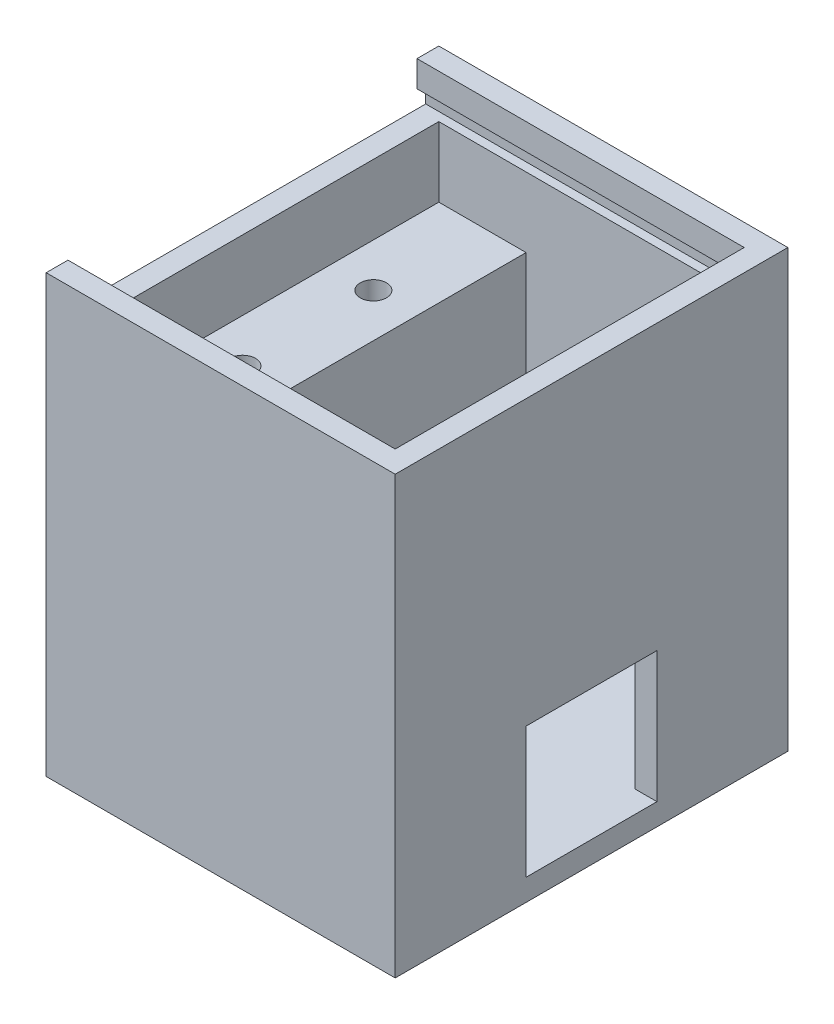
ISO-10303-21;
HEADER;
FILE_DESCRIPTION(('STEP AP214'),'2;1');
FILE_NAME('part.step','',(''),(''),'','','');
FILE_SCHEMA(('AUTOMOTIVE_DESIGN { 1 0 10303 214 1 1 1 1 }'));
ENDSEC;
DATA;
#1=APPLICATION_CONTEXT('core data for automotive mechanical design processes');
#2=APPLICATION_PROTOCOL_DEFINITION('international standard','automotive_design',2000,#1);
#3=PRODUCT_CONTEXT('',#1,'mechanical');
#4=PRODUCT('Part','Part','',(#3));
#5=PRODUCT_RELATED_PRODUCT_CATEGORY('part','',(#4));
#6=PRODUCT_DEFINITION_FORMATION('','',#4);
#7=PRODUCT_DEFINITION_CONTEXT('part definition',#1,'design');
#8=PRODUCT_DEFINITION('design','',#6,#7);
#9=PRODUCT_DEFINITION_SHAPE('','',#8);
#10=(LENGTH_UNIT() NAMED_UNIT(*) SI_UNIT(.MILLI.,.METRE.));
#11=(NAMED_UNIT(*) PLANE_ANGLE_UNIT() SI_UNIT($,.RADIAN.));
#12=(NAMED_UNIT(*) SI_UNIT($,.STERADIAN.) SOLID_ANGLE_UNIT());
#13=UNCERTAINTY_MEASURE_WITH_UNIT(LENGTH_MEASURE(1.E-05),#10,'distance_accuracy_value','');
#14=(GEOMETRIC_REPRESENTATION_CONTEXT(3) GLOBAL_UNCERTAINTY_ASSIGNED_CONTEXT((#13)) GLOBAL_UNIT_ASSIGNED_CONTEXT((#10,
#11,#12)) REPRESENTATION_CONTEXT('',''));
#15=CARTESIAN_POINT('',(0.,0.,0.));
#16=DIRECTION('',(0.,0.,1.));
#17=DIRECTION('',(1.,0.,0.));
#18=AXIS2_PLACEMENT_3D('',#15,#16,#17);
#19=CARTESIAN_POINT('',(-27.3887004628611,0.,15.9496536364091));
#20=DIRECTION('',(0.,1.,0.));
#21=DIRECTION('',(0.,0.,1.));
#22=AXIS2_PLACEMENT_3D('',#19,#20,#21);
#23=CYLINDRICAL_SURFACE('',#22,1.5);
#24=CARTESIAN_POINT('',(-27.3887004628611,37.,15.9496536364091));
#25=DIRECTION('',(0.,1.,0.));
#26=DIRECTION('',(0.,0.,1.));
#27=AXIS2_PLACEMENT_3D('',#24,#25,#26);
#28=CIRCLE('',#27,1.5);
#29=CARTESIAN_POINT('',(-27.3887004628611,37.,17.4496536364091));
#30=VERTEX_POINT('',#29);
#31=EDGE_CURVE('E234',#30,#30,#28,.T.);
#32=ORIENTED_EDGE('',*,*,#31,.T.);
#33=EDGE_LOOP('',(#32));
#34=FACE_BOUND('',#33,.T.);
#35=CARTESIAN_POINT('',(-27.3887004628611,5.,15.9496536364091));
#36=DIRECTION('',(0.,-1.,0.));
#37=DIRECTION('',(0.,0.,-1.));
#38=AXIS2_PLACEMENT_3D('',#35,#36,#37);
#39=CIRCLE('',#38,1.5);
#40=CARTESIAN_POINT('',(-27.3887004628611,5.,14.4496536364091));
#41=VERTEX_POINT('',#40);
#42=EDGE_CURVE('E37',#41,#41,#39,.F.);
#43=ORIENTED_EDGE('',*,*,#42,.F.);
#44=EDGE_LOOP('',(#43));
#45=FACE_BOUND('',#44,.T.);
#46=ADVANCED_FACE('F33',(#34,#45),#23,.F.);
#47=CARTESIAN_POINT('',(-27.3887004628611,0.,0.949653636409073));
#48=DIRECTION('',(0.,1.,0.));
#49=DIRECTION('',(0.,0.,1.));
#50=AXIS2_PLACEMENT_3D('',#47,#48,#49);
#51=CYLINDRICAL_SURFACE('',#50,1.5);
#52=CARTESIAN_POINT('',(-27.3887004628611,37.,0.949653636409079));
#53=DIRECTION('',(0.,1.,0.));
#54=DIRECTION('',(0.,0.,1.));
#55=AXIS2_PLACEMENT_3D('',#52,#53,#54);
#56=CIRCLE('',#55,1.5);
#57=CARTESIAN_POINT('',(-27.3887004628611,37.,2.44965363640908));
#58=VERTEX_POINT('',#57);
#59=EDGE_CURVE('E231',#58,#58,#56,.T.);
#60=ORIENTED_EDGE('',*,*,#59,.T.);
#61=EDGE_LOOP('',(#60));
#62=FACE_BOUND('',#61,.T.);
#63=CARTESIAN_POINT('',(-27.3887004628611,5.,0.949653636409074));
#64=DIRECTION('',(0.,-1.,0.));
#65=DIRECTION('',(0.,0.,-1.));
#66=AXIS2_PLACEMENT_3D('',#63,#64,#65);
#67=CIRCLE('',#66,1.5);
#68=CARTESIAN_POINT('',(-27.3887004628611,5.,-0.550346363590927));
#69=VERTEX_POINT('',#68);
#70=EDGE_CURVE('E222',#69,#69,#67,.F.);
#71=ORIENTED_EDGE('',*,*,#70,.F.);
#72=EDGE_LOOP('',(#71));
#73=FACE_BOUND('',#72,.T.);
#74=ADVANCED_FACE('F379',(#62,#73),#51,.F.);
#75=CARTESIAN_POINT('',(-34.8887004628611,50.,28.4496536364091));
#76=DIRECTION('',(0.,0.,-1.));
#77=DIRECTION('',(-1.,0.,0.));
#78=AXIS2_PLACEMENT_3D('',#75,#76,#77);
#79=PLANE('',#78);
#80=DIRECTION('',(-1.,0.,0.));
#81=VECTOR('',#80,1.);
#82=CARTESIAN_POINT('',(-34.8887004628611,45.,28.4496536364091));
#83=LINE('',#82,#81);
#84=CARTESIAN_POINT('',(2.61129953713887,45.,28.4496536364091));
#85=VERTEX_POINT('',#84);
#86=CARTESIAN_POINT('',(-32.3887004628611,45.,28.4496536364091));
#87=VERTEX_POINT('',#86);
#88=EDGE_CURVE('E242',#85,#87,#83,.T.);
#89=ORIENTED_EDGE('',*,*,#88,.F.);
#90=DIRECTION('',(0.,-1.,0.));
#91=VECTOR('',#90,1.);
#92=CARTESIAN_POINT('',(2.61129953713887,50.,28.4496536364091));
#93=LINE('',#92,#91);
#94=CARTESIAN_POINT('',(2.61129953713887,2.5,28.4496536364091));
#95=VERTEX_POINT('',#94);
#96=EDGE_CURVE('E329',#85,#95,#93,.T.);
#97=ORIENTED_EDGE('',*,*,#96,.T.);
#98=DIRECTION('',(1.,0.,0.));
#99=VECTOR('',#98,1.);
#100=CARTESIAN_POINT('',(-34.8887004628611,2.5,28.4496536364091));
#101=LINE('',#100,#99);
#102=CARTESIAN_POINT('',(-22.3887004628611,2.5,28.4496536364091));
#103=VERTEX_POINT('',#102);
#104=EDGE_CURVE('E315',#103,#95,#101,.T.);
#105=ORIENTED_EDGE('',*,*,#104,.F.);
#106=DIRECTION('',(0.,-1.,0.));
#107=VECTOR('',#106,1.);
#108=CARTESIAN_POINT('',(-22.3887004628611,2.49999999999999,28.4496536364091));
#109=LINE('',#108,#107);
#110=CARTESIAN_POINT('',(-22.3887004628611,37.,28.4496536364091));
#111=VERTEX_POINT('',#110);
#112=EDGE_CURVE('E301',#111,#103,#109,.T.);
#113=ORIENTED_EDGE('',*,*,#112,.F.);
#114=DIRECTION('',(-1.,0.,0.));
#115=VECTOR('',#114,1.);
#116=CARTESIAN_POINT('',(-22.3887004628611,37.,28.4496536364091));
#117=LINE('',#116,#115);
#118=CARTESIAN_POINT('',(-32.3887004628611,37.,28.4496536364091));
#119=VERTEX_POINT('',#118);
#120=EDGE_CURVE('E307',#111,#119,#117,.T.);
#121=ORIENTED_EDGE('',*,*,#120,.T.);
#122=DIRECTION('',(0.,-1.,0.));
#123=VECTOR('',#122,1.);
#124=CARTESIAN_POINT('',(-32.3887004628611,50.,28.4496536364091));
#125=LINE('',#124,#123);
#126=EDGE_CURVE('E316',#87,#119,#125,.T.);
#127=ORIENTED_EDGE('',*,*,#126,.F.);
#128=EDGE_LOOP('',(#89,#97,#105,#113,#121,#127));
#129=FACE_BOUND('',#128,.T.);
#130=ADVANCED_FACE('F385',(#129),#79,.T.);
#131=CARTESIAN_POINT('',(-34.8887004628611,50.,-11.5503463635909));
#132=DIRECTION('',(0.,0.,1.));
#133=DIRECTION('',(1.,0.,0.));
#134=AXIS2_PLACEMENT_3D('',#131,#132,#133);
#135=PLANE('',#134);
#136=DIRECTION('',(-1.,0.,0.));
#137=VECTOR('',#136,1.);
#138=CARTESIAN_POINT('',(-34.8887004628611,47.,-11.5503463635909));
#139=LINE('',#138,#137);
#140=CARTESIAN_POINT('',(2.61129953713886,47.,-11.5503463635909));
#141=VERTEX_POINT('',#140);
#142=CARTESIAN_POINT('',(-34.8887004628611,47.,-11.5503463635909));
#143=VERTEX_POINT('',#142);
#144=EDGE_CURVE('E265',#141,#143,#139,.T.);
#145=ORIENTED_EDGE('',*,*,#144,.F.);
#146=DIRECTION('',(0.,-1.,0.));
#147=VECTOR('',#146,1.);
#148=CARTESIAN_POINT('',(2.61129953713887,50.,-11.5503463635909));
#149=LINE('',#148,#147);
#150=CARTESIAN_POINT('',(2.61129953713886,50.,-11.5503463635909));
#151=VERTEX_POINT('',#150);
#152=EDGE_CURVE('E334',#151,#141,#149,.T.);
#153=ORIENTED_EDGE('',*,*,#152,.F.);
#154=DIRECTION('',(-1.,0.,0.));
#155=VECTOR('',#154,1.);
#156=CARTESIAN_POINT('',(-34.8887004628611,50.,-11.5503463635909));
#157=LINE('',#156,#155);
#158=CARTESIAN_POINT('',(-34.8887004628611,50.,-11.5503463635909));
#159=VERTEX_POINT('',#158);
#160=EDGE_CURVE('E323',#151,#159,#157,.T.);
#161=ORIENTED_EDGE('',*,*,#160,.T.);
#162=DIRECTION('',(0.,1.,0.));
#163=VECTOR('',#162,1.);
#164=CARTESIAN_POINT('',(-34.8887004628611,50.,-11.5503463635909));
#165=LINE('',#164,#163);
#166=EDGE_CURVE('E285',#143,#159,#165,.T.);
#167=ORIENTED_EDGE('',*,*,#166,.F.);
#168=EDGE_LOOP('',(#145,#153,#161,#167));
#169=FACE_BOUND('',#168,.T.);
#170=ADVANCED_FACE('F424',(#169),#135,.T.);
#171=CARTESIAN_POINT('',(-32.3887004628611,50.,-14.0503463635909));
#172=DIRECTION('',(1.,0.,0.));
#173=DIRECTION('',(0.,0.,-1.));
#174=AXIS2_PLACEMENT_3D('',#171,#172,#173);
#175=PLANE('',#174);
#176=DIRECTION('',(0.,0.,-1.));
#177=VECTOR('',#176,1.);
#178=CARTESIAN_POINT('',(-32.3887004628611,45.,-11.5503463635909));
#179=LINE('',#178,#177);
#180=CARTESIAN_POINT('',(-32.3887004628611,45.,-11.5503463635909));
#181=VERTEX_POINT('',#180);
#182=EDGE_CURVE('E280',#87,#181,#179,.T.);
#183=ORIENTED_EDGE('',*,*,#182,.F.);
#184=ORIENTED_EDGE('',*,*,#126,.T.);
#185=DIRECTION('',(0.,0.,1.));
#186=VECTOR('',#185,1.);
#187=CARTESIAN_POINT('',(-32.3887004628611,37.,-11.5503463635909));
#188=LINE('',#187,#186);
#189=CARTESIAN_POINT('',(-32.3887004628611,37.,-11.5503463635909));
#190=VERTEX_POINT('',#189);
#191=EDGE_CURVE('E292',#190,#119,#188,.T.);
#192=ORIENTED_EDGE('',*,*,#191,.F.);
#193=DIRECTION('',(0.,-1.,0.));
#194=VECTOR('',#193,1.);
#195=CARTESIAN_POINT('',(-32.3887004628611,50.,-11.5503463635909));
#196=LINE('',#195,#194);
#197=EDGE_CURVE('E320',#181,#190,#196,.T.);
#198=ORIENTED_EDGE('',*,*,#197,.F.);
#199=EDGE_LOOP('',(#183,#184,#192,#198));
#200=FACE_BOUND('',#199,.T.);
#201=ADVANCED_FACE('F420',(#200),#175,.T.);
#202=DIRECTION('',(1.,0.,0.));
#203=VECTOR('',#202,1.);
#204=CARTESIAN_POINT('',(-34.8887004628611,47.,28.4496536364091));
#205=LINE('',#204,#203);
#206=CARTESIAN_POINT('',(-34.8887004628611,47.,28.4496536364091));
#207=VERTEX_POINT('',#206);
#208=CARTESIAN_POINT('',(2.61129953713887,47.,28.4496536364091));
#209=VERTEX_POINT('',#208);
#210=EDGE_CURVE('E237',#207,#209,#205,.T.);
#211=ORIENTED_EDGE('',*,*,#210,.F.);
#212=DIRECTION('',(0.,-1.,0.));
#213=VECTOR('',#212,1.);
#214=CARTESIAN_POINT('',(-34.8887004628611,50.,28.4496536364091));
#215=LINE('',#214,#213);
#216=CARTESIAN_POINT('',(-34.8887004628611,50.,28.4496536364091));
#217=VERTEX_POINT('',#216);
#218=EDGE_CURVE('E287',#217,#207,#215,.T.);
#219=ORIENTED_EDGE('',*,*,#218,.F.);
#220=DIRECTION('',(1.,0.,0.));
#221=VECTOR('',#220,1.);
#222=CARTESIAN_POINT('',(-34.8887004628611,50.,28.4496536364091));
#223=LINE('',#222,#221);
#224=CARTESIAN_POINT('',(2.61129953713887,50.,28.4496536364091));
#225=VERTEX_POINT('',#224);
#226=EDGE_CURVE('E338',#217,#225,#223,.T.);
#227=ORIENTED_EDGE('',*,*,#226,.T.);
#228=EDGE_CURVE('E319',#225,#209,#93,.T.);
#229=ORIENTED_EDGE('',*,*,#228,.T.);
#230=EDGE_LOOP('',(#211,#219,#227,#229));
#231=FACE_BOUND('',#230,.T.);
#232=ADVANCED_FACE('F423',(#231),#79,.T.);
#233=DIRECTION('',(1.,0.,0.));
#234=VECTOR('',#233,1.);
#235=CARTESIAN_POINT('',(-34.8887004628611,45.,-11.5503463635909));
#236=LINE('',#235,#234);
#237=CARTESIAN_POINT('',(2.61129953713887,45.,-11.5503463635909));
#238=VERTEX_POINT('',#237);
#239=EDGE_CURVE('E257',#181,#238,#236,.T.);
#240=ORIENTED_EDGE('',*,*,#239,.F.);
#241=ORIENTED_EDGE('',*,*,#197,.T.);
#242=DIRECTION('',(-1.,0.,0.));
#243=VECTOR('',#242,1.);
#244=CARTESIAN_POINT('',(-22.3887004628611,37.,-11.5503463635909));
#245=LINE('',#244,#243);
#246=CARTESIAN_POINT('',(-22.3887004628611,37.,-11.5503463635909));
#247=VERTEX_POINT('',#246);
#248=EDGE_CURVE('E312',#247,#190,#245,.T.);
#249=ORIENTED_EDGE('',*,*,#248,.F.);
#250=DIRECTION('',(0.,1.,0.));
#251=VECTOR('',#250,1.);
#252=CARTESIAN_POINT('',(-22.3887004628611,2.5,-11.5503463635909));
#253=LINE('',#252,#251);
#254=CARTESIAN_POINT('',(-22.3887004628611,2.5,-11.5503463635909));
#255=VERTEX_POINT('',#254);
#256=EDGE_CURVE('E295',#255,#247,#253,.T.);
#257=ORIENTED_EDGE('',*,*,#256,.F.);
#258=DIRECTION('',(-1.,0.,0.));
#259=VECTOR('',#258,1.);
#260=CARTESIAN_POINT('',(-34.8887004628611,2.5,-11.5503463635909));
#261=LINE('',#260,#259);
#262=CARTESIAN_POINT('',(2.61129953713886,2.5,-11.5503463635909));
#263=VERTEX_POINT('',#262);
#264=EDGE_CURVE('E333',#263,#255,#261,.T.);
#265=ORIENTED_EDGE('',*,*,#264,.F.);
#266=EDGE_CURVE('E322',#238,#263,#149,.T.);
#267=ORIENTED_EDGE('',*,*,#266,.F.);
#268=EDGE_LOOP('',(#240,#241,#249,#257,#265,#267));
#269=FACE_BOUND('',#268,.T.);
#270=ADVANCED_FACE('F428',(#269),#135,.T.);
#271=CARTESIAN_POINT('',(-34.8887004628611,50.,-14.0503463635909));
#272=DIRECTION('',(1.,0.,0.));
#273=DIRECTION('',(0.,0.,-1.));
#274=AXIS2_PLACEMENT_3D('',#271,#272,#273);
#275=PLANE('',#274);
#276=DIRECTION('',(0.,1.,0.));
#277=VECTOR('',#276,1.);
#278=CARTESIAN_POINT('',(-34.8887004628611,45.,29.4496536364091));
#279=LINE('',#278,#277);
#280=CARTESIAN_POINT('',(-34.8887004628611,45.,29.4496536364091));
#281=VERTEX_POINT('',#280);
#282=CARTESIAN_POINT('',(-34.8887004628611,47.,29.4496536364091));
#283=VERTEX_POINT('',#282);
#284=EDGE_CURVE('E238',#281,#283,#279,.T.);
#285=ORIENTED_EDGE('',*,*,#284,.F.);
#286=DIRECTION('',(0.,0.,-1.));
#287=VECTOR('',#286,1.);
#288=CARTESIAN_POINT('',(-34.8887004628611,45.,-11.5503463635909));
#289=LINE('',#288,#287);
#290=CARTESIAN_POINT('',(-34.8887004628611,45.,-12.5503463635909));
#291=VERTEX_POINT('',#290);
#292=EDGE_CURVE('E290',#281,#291,#289,.T.);
#293=ORIENTED_EDGE('',*,*,#292,.T.);
#294=DIRECTION('',(0.,-1.,0.));
#295=VECTOR('',#294,1.);
#296=CARTESIAN_POINT('',(-34.8887004628611,45.,-12.5503463635909));
#297=LINE('',#296,#295);
#298=CARTESIAN_POINT('',(-34.8887004628611,47.,-12.5503463635909));
#299=VERTEX_POINT('',#298);
#300=EDGE_CURVE('E261',#299,#291,#297,.T.);
#301=ORIENTED_EDGE('',*,*,#300,.F.);
#302=DIRECTION('',(0.,0.,1.));
#303=VECTOR('',#302,1.);
#304=CARTESIAN_POINT('',(-34.8887004628611,47.,-12.5503463635909));
#305=LINE('',#304,#303);
#306=EDGE_CURVE('E277',#299,#143,#305,.T.);
#307=ORIENTED_EDGE('',*,*,#306,.T.);
#308=ORIENTED_EDGE('',*,*,#166,.T.);
#309=DIRECTION('',(0.,0.,1.));
#310=VECTOR('',#309,1.);
#311=CARTESIAN_POINT('',(-34.8887004628611,50.,-14.0503463635909));
#312=LINE('',#311,#310);
#313=CARTESIAN_POINT('',(-34.8887004628611,50.,-14.0503463635909));
#314=VERTEX_POINT('',#313);
#315=EDGE_CURVE('E345',#314,#159,#312,.T.);
#316=ORIENTED_EDGE('',*,*,#315,.F.);
#317=DIRECTION('',(0.,-1.,0.));
#318=VECTOR('',#317,1.);
#319=CARTESIAN_POINT('',(-34.8887004628611,50.,-14.0503463635909));
#320=LINE('',#319,#318);
#321=CARTESIAN_POINT('',(-34.8887004628611,0.,-14.0503463635909));
#322=VERTEX_POINT('',#321);
#323=EDGE_CURVE('E355',#314,#322,#320,.T.);
#324=ORIENTED_EDGE('',*,*,#323,.T.);
#325=DIRECTION('',(0.,0.,1.));
#326=VECTOR('',#325,1.);
#327=CARTESIAN_POINT('',(-34.8887004628611,0.,-14.0503463635909));
#328=LINE('',#327,#326);
#329=CARTESIAN_POINT('',(-34.8887004628611,0.,30.9496536364091));
#330=VERTEX_POINT('',#329);
#331=EDGE_CURVE('E318',#322,#330,#328,.T.);
#332=ORIENTED_EDGE('',*,*,#331,.T.);
#333=DIRECTION('',(0.,-1.,0.));
#334=VECTOR('',#333,1.);
#335=CARTESIAN_POINT('',(-34.8887004628611,50.,30.9496536364091));
#336=LINE('',#335,#334);
#337=CARTESIAN_POINT('',(-34.8887004628611,50.,30.9496536364091));
#338=VERTEX_POINT('',#337);
#339=EDGE_CURVE('E11',#338,#330,#336,.T.);
#340=ORIENTED_EDGE('',*,*,#339,.F.);
#341=EDGE_CURVE('E349',#217,#338,#312,.T.);
#342=ORIENTED_EDGE('',*,*,#341,.F.);
#343=ORIENTED_EDGE('',*,*,#218,.T.);
#344=DIRECTION('',(0.,0.,-1.));
#345=VECTOR('',#344,1.);
#346=CARTESIAN_POINT('',(-34.8887004628611,47.,29.4496536364091));
#347=LINE('',#346,#345);
#348=EDGE_CURVE('E251',#283,#207,#347,.T.);
#349=ORIENTED_EDGE('',*,*,#348,.F.);
#350=EDGE_LOOP('',(#285,#293,#301,#307,#308,#316,#324,#332,#340,#342,#343,#349));
#351=FACE_BOUND('',#350,.T.);
#352=ADVANCED_FACE('F35',(#351),#275,.F.);
#353=CARTESIAN_POINT('',(-34.8887004628611,50.,30.9496536364091));
#354=DIRECTION('',(0.,0.,-1.));
#355=DIRECTION('',(-1.,0.,0.));
#356=AXIS2_PLACEMENT_3D('',#353,#354,#355);
#357=PLANE('',#356);
#358=DIRECTION('',(1.,0.,0.));
#359=VECTOR('',#358,1.);
#360=CARTESIAN_POINT('',(-34.8887004628611,0.,30.9496536364091));
#361=LINE('',#360,#359);
#362=CARTESIAN_POINT('',(5.11129953713887,0.,30.9496536364091));
#363=VERTEX_POINT('',#362);
#364=EDGE_CURVE('E358',#330,#363,#361,.T.);
#365=ORIENTED_EDGE('',*,*,#364,.T.);
#366=DIRECTION('',(0.,-1.,0.));
#367=VECTOR('',#366,1.);
#368=CARTESIAN_POINT('',(5.11129953713887,50.,30.9496536364091));
#369=LINE('',#368,#367);
#370=CARTESIAN_POINT('',(5.11129953713887,50.,30.9496536364091));
#371=VERTEX_POINT('',#370);
#372=EDGE_CURVE('E42',#371,#363,#369,.T.);
#373=ORIENTED_EDGE('',*,*,#372,.F.);
#374=DIRECTION('',(1.,0.,0.));
#375=VECTOR('',#374,1.);
#376=CARTESIAN_POINT('',(-34.8887004628611,50.,30.9496536364091));
#377=LINE('',#376,#375);
#378=EDGE_CURVE('E348',#338,#371,#377,.T.);
#379=ORIENTED_EDGE('',*,*,#378,.F.);
#380=ORIENTED_EDGE('',*,*,#339,.T.);
#381=EDGE_LOOP('',(#365,#373,#379,#380));
#382=FACE_BOUND('',#381,.T.);
#383=ADVANCED_FACE('F453',(#382),#357,.F.);
#384=CARTESIAN_POINT('',(5.11129953713886,50.,-14.0503463635909));
#385=DIRECTION('',(-1.,0.,0.));
#386=DIRECTION('',(0.,0.,1.));
#387=AXIS2_PLACEMENT_3D('',#384,#385,#386);
#388=PLANE('',#387);
#389=DIRECTION('',(0.,0.,1.));
#390=VECTOR('',#389,1.);
#391=CARTESIAN_POINT('',(5.11129953713887,2.5,15.9496536364091));
#392=LINE('',#391,#390);
#393=CARTESIAN_POINT('',(5.11129953713886,2.5,0.949653636409072));
#394=VERTEX_POINT('',#393);
#395=CARTESIAN_POINT('',(5.11129953713887,2.5,15.9496536364091));
#396=VERTEX_POINT('',#395);
#397=EDGE_CURVE('E195',#394,#396,#392,.T.);
#398=ORIENTED_EDGE('',*,*,#397,.T.);
#399=DIRECTION('',(0.,1.,0.));
#400=VECTOR('',#399,1.);
#401=CARTESIAN_POINT('',(5.11129953713887,2.5,15.9496536364091));
#402=LINE('',#401,#400);
#403=CARTESIAN_POINT('',(5.11129953713887,17.5,15.9496536364091));
#404=VERTEX_POINT('',#403);
#405=EDGE_CURVE('E187',#396,#404,#402,.T.);
#406=ORIENTED_EDGE('',*,*,#405,.T.);
#407=DIRECTION('',(0.,0.,-1.));
#408=VECTOR('',#407,1.);
#409=CARTESIAN_POINT('',(5.11129953713887,17.5,15.9496536364091));
#410=LINE('',#409,#408);
#411=CARTESIAN_POINT('',(5.11129953713886,17.5,0.949653636409071));
#412=VERTEX_POINT('',#411);
#413=EDGE_CURVE('E198',#404,#412,#410,.T.);
#414=ORIENTED_EDGE('',*,*,#413,.T.);
#415=DIRECTION('',(0.,-1.,0.));
#416=VECTOR('',#415,1.);
#417=CARTESIAN_POINT('',(5.11129953713886,2.5,0.949653636409072));
#418=LINE('',#417,#416);
#419=EDGE_CURVE('E50',#412,#394,#418,.T.);
#420=ORIENTED_EDGE('',*,*,#419,.T.);
#421=EDGE_LOOP('',(#398,#406,#414,#420));
#422=FACE_BOUND('',#421,.T.);
#423=DIRECTION('',(0.,0.,-1.));
#424=VECTOR('',#423,1.);
#425=CARTESIAN_POINT('',(5.11129953713886,0.,-14.0503463635909));
#426=LINE('',#425,#424);
#427=CARTESIAN_POINT('',(5.11129953713886,0.,-14.0503463635909));
#428=VERTEX_POINT('',#427);
#429=EDGE_CURVE('E360',#363,#428,#426,.T.);
#430=ORIENTED_EDGE('',*,*,#429,.T.);
#431=DIRECTION('',(0.,-1.,0.));
#432=VECTOR('',#431,1.);
#433=CARTESIAN_POINT('',(5.11129953713886,50.,-14.0503463635909));
#434=LINE('',#433,#432);
#435=CARTESIAN_POINT('',(5.11129953713886,50.,-14.0503463635909));
#436=VERTEX_POINT('',#435);
#437=EDGE_CURVE('E366',#436,#428,#434,.T.);
#438=ORIENTED_EDGE('',*,*,#437,.F.);
#439=DIRECTION('',(0.,0.,-1.));
#440=VECTOR('',#439,1.);
#441=CARTESIAN_POINT('',(5.11129953713886,50.,-14.0503463635909));
#442=LINE('',#441,#440);
#443=EDGE_CURVE('E351',#371,#436,#442,.T.);
#444=ORIENTED_EDGE('',*,*,#443,.F.);
#445=ORIENTED_EDGE('',*,*,#372,.T.);
#446=EDGE_LOOP('',(#430,#438,#444,#445));
#447=FACE_BOUND('',#446,.T.);
#448=ADVANCED_FACE('F202',(#422,#447),#388,.F.);
#449=CARTESIAN_POINT('',(-34.8887004628611,50.,-14.0503463635909));
#450=DIRECTION('',(0.,0.,1.));
#451=DIRECTION('',(1.,0.,0.));
#452=AXIS2_PLACEMENT_3D('',#449,#450,#451);
#453=PLANE('',#452);
#454=DIRECTION('',(-1.,0.,0.));
#455=VECTOR('',#454,1.);
#456=CARTESIAN_POINT('',(-34.8887004628611,0.,-14.0503463635909));
#457=LINE('',#456,#455);
#458=EDGE_CURVE('E362',#428,#322,#457,.T.);
#459=ORIENTED_EDGE('',*,*,#458,.T.);
#460=ORIENTED_EDGE('',*,*,#323,.F.);
#461=DIRECTION('',(-1.,0.,0.));
#462=VECTOR('',#461,1.);
#463=CARTESIAN_POINT('',(-34.8887004628611,50.,-14.0503463635909));
#464=LINE('',#463,#462);
#465=EDGE_CURVE('E353',#436,#314,#464,.T.);
#466=ORIENTED_EDGE('',*,*,#465,.F.);
#467=ORIENTED_EDGE('',*,*,#437,.T.);
#468=EDGE_LOOP('',(#459,#460,#466,#467));
#469=FACE_BOUND('',#468,.T.);
#470=ADVANCED_FACE('F444',(#469),#453,.F.);
#471=CARTESIAN_POINT('',(0.,50.,0.));
#472=DIRECTION('',(0.,1.,0.));
#473=DIRECTION('',(0.,0.,1.));
#474=AXIS2_PLACEMENT_3D('',#471,#472,#473);
#475=PLANE('',#474);
#476=ORIENTED_EDGE('',*,*,#315,.T.);
#477=ORIENTED_EDGE('',*,*,#160,.F.);
#478=DIRECTION('',(0.,0.,-1.));
#479=VECTOR('',#478,1.);
#480=CARTESIAN_POINT('',(2.61129953713886,50.,-14.0503463635909));
#481=LINE('',#480,#479);
#482=EDGE_CURVE('E340',#225,#151,#481,.T.);
#483=ORIENTED_EDGE('',*,*,#482,.F.);
#484=ORIENTED_EDGE('',*,*,#226,.F.);
#485=ORIENTED_EDGE('',*,*,#341,.T.);
#486=ORIENTED_EDGE('',*,*,#378,.T.);
#487=ORIENTED_EDGE('',*,*,#443,.T.);
#488=ORIENTED_EDGE('',*,*,#465,.T.);
#489=EDGE_LOOP('',(#476,#477,#483,#484,#485,#486,#487,#488));
#490=FACE_BOUND('',#489,.T.);
#491=ADVANCED_FACE('F441',(#490),#475,.T.);
#492=CARTESIAN_POINT('',(0.,0.,0.));
#493=DIRECTION('',(0.,1.,0.));
#494=DIRECTION('',(0.,0.,1.));
#495=AXIS2_PLACEMENT_3D('',#492,#493,#494);
#496=PLANE('',#495);
#497=CARTESIAN_POINT('',(-27.3887004628611,0.,15.9496536364091));
#498=DIRECTION('',(0.,-1.,0.));
#499=DIRECTION('',(0.,0.,-1.));
#500=AXIS2_PLACEMENT_3D('',#497,#498,#499);
#501=CIRCLE('',#500,2.99999999999999);
#502=CARTESIAN_POINT('',(-27.3887004628611,0.,12.9496536364091));
#503=VERTEX_POINT('',#502);
#504=EDGE_CURVE('E223',#503,#503,#501,.T.);
#505=ORIENTED_EDGE('',*,*,#504,.F.);
#506=EDGE_LOOP('',(#505));
#507=FACE_BOUND('',#506,.T.);
#508=CARTESIAN_POINT('',(-27.3887004628611,0.,0.949653636409073));
#509=DIRECTION('',(0.,-1.,0.));
#510=DIRECTION('',(0.,0.,-1.));
#511=AXIS2_PLACEMENT_3D('',#508,#509,#510);
#512=CIRCLE('',#511,3.);
#513=CARTESIAN_POINT('',(-27.3887004628611,0.,-2.05034636359092));
#514=VERTEX_POINT('',#513);
#515=EDGE_CURVE('E215',#514,#514,#512,.T.);
#516=ORIENTED_EDGE('',*,*,#515,.F.);
#517=EDGE_LOOP('',(#516));
#518=FACE_BOUND('',#517,.T.);
#519=ORIENTED_EDGE('',*,*,#331,.F.);
#520=ORIENTED_EDGE('',*,*,#458,.F.);
#521=ORIENTED_EDGE('',*,*,#429,.F.);
#522=ORIENTED_EDGE('',*,*,#364,.F.);
#523=EDGE_LOOP('',(#519,#520,#521,#522));
#524=FACE_BOUND('',#523,.T.);
#525=ADVANCED_FACE('F433',(#507,#518,#524),#496,.F.);
#526=CARTESIAN_POINT('',(2.61129953713886,50.,-14.0503463635909));
#527=DIRECTION('',(-1.,0.,0.));
#528=DIRECTION('',(0.,0.,1.));
#529=AXIS2_PLACEMENT_3D('',#526,#527,#528);
#530=PLANE('',#529);
#531=DIRECTION('',(0.,1.,0.));
#532=VECTOR('',#531,1.);
#533=CARTESIAN_POINT('',(2.61129953713887,2.5,15.9496536364091));
#534=LINE('',#533,#532);
#535=CARTESIAN_POINT('',(2.61129953713887,2.5,15.9496536364091));
#536=VERTEX_POINT('',#535);
#537=CARTESIAN_POINT('',(2.61129953713887,17.5,15.9496536364091));
#538=VERTEX_POINT('',#537);
#539=EDGE_CURVE('E190',#536,#538,#534,.T.);
#540=ORIENTED_EDGE('',*,*,#539,.F.);
#541=DIRECTION('',(0.,0.,-1.));
#542=VECTOR('',#541,1.);
#543=CARTESIAN_POINT('',(2.61129953713886,2.5,-14.0503463635909));
#544=LINE('',#543,#542);
#545=EDGE_CURVE('E330',#95,#536,#544,.T.);
#546=ORIENTED_EDGE('',*,*,#545,.F.);
#547=ORIENTED_EDGE('',*,*,#96,.F.);
#548=DIRECTION('',(0.,0.,-1.));
#549=VECTOR('',#548,1.);
#550=CARTESIAN_POINT('',(2.61129953713887,45.,29.4496536364091));
#551=LINE('',#550,#549);
#552=CARTESIAN_POINT('',(2.61129953713887,45.,29.4496536364091));
#553=VERTEX_POINT('',#552);
#554=EDGE_CURVE('E255',#553,#85,#551,.T.);
#555=ORIENTED_EDGE('',*,*,#554,.F.);
#556=DIRECTION('',(0.,-1.,0.));
#557=VECTOR('',#556,1.);
#558=CARTESIAN_POINT('',(2.61129953713887,45.,29.4496536364091));
#559=LINE('',#558,#557);
#560=CARTESIAN_POINT('',(2.61129953713887,47.,29.4496536364091));
#561=VERTEX_POINT('',#560);
#562=EDGE_CURVE('E245',#561,#553,#559,.T.);
#563=ORIENTED_EDGE('',*,*,#562,.F.);
#564=DIRECTION('',(0.,0.,-1.));
#565=VECTOR('',#564,1.);
#566=CARTESIAN_POINT('',(2.61129953713887,47.,29.4496536364091));
#567=LINE('',#566,#565);
#568=EDGE_CURVE('E258',#561,#209,#567,.T.);
#569=ORIENTED_EDGE('',*,*,#568,.T.);
#570=ORIENTED_EDGE('',*,*,#228,.F.);
#571=ORIENTED_EDGE('',*,*,#482,.T.);
#572=ORIENTED_EDGE('',*,*,#152,.T.);
#573=DIRECTION('',(0.,0.,1.));
#574=VECTOR('',#573,1.);
#575=CARTESIAN_POINT('',(2.61129953713886,47.,-12.5503463635909));
#576=LINE('',#575,#574);
#577=CARTESIAN_POINT('',(2.61129953713886,47.,-12.5503463635909));
#578=VERTEX_POINT('',#577);
#579=EDGE_CURVE('E281',#578,#141,#576,.T.);
#580=ORIENTED_EDGE('',*,*,#579,.F.);
#581=DIRECTION('',(0.,1.,0.));
#582=VECTOR('',#581,1.);
#583=CARTESIAN_POINT('',(2.61129953713887,45.,-12.5503463635909));
#584=LINE('',#583,#582);
#585=CARTESIAN_POINT('',(2.61129953713887,45.,-12.5503463635909));
#586=VERTEX_POINT('',#585);
#587=EDGE_CURVE('E268',#586,#578,#584,.T.);
#588=ORIENTED_EDGE('',*,*,#587,.F.);
#589=DIRECTION('',(0.,0.,1.));
#590=VECTOR('',#589,1.);
#591=CARTESIAN_POINT('',(2.61129953713887,45.,-12.5503463635909));
#592=LINE('',#591,#590);
#593=EDGE_CURVE('E274',#586,#238,#592,.T.);
#594=ORIENTED_EDGE('',*,*,#593,.T.);
#595=ORIENTED_EDGE('',*,*,#266,.T.);
#596=CARTESIAN_POINT('',(2.61129953713886,2.5,0.949653636409073));
#597=VERTEX_POINT('',#596);
#598=EDGE_CURVE('E326',#597,#263,#544,.T.);
#599=ORIENTED_EDGE('',*,*,#598,.F.);
#600=DIRECTION('',(0.,-1.,0.));
#601=VECTOR('',#600,1.);
#602=CARTESIAN_POINT('',(2.61129953713886,2.5,0.949653636409073));
#603=LINE('',#602,#601);
#604=CARTESIAN_POINT('',(2.61129953713886,17.5,0.949653636409073));
#605=VERTEX_POINT('',#604);
#606=EDGE_CURVE('E55',#605,#597,#603,.T.);
#607=ORIENTED_EDGE('',*,*,#606,.F.);
#608=DIRECTION('',(0.,0.,-1.));
#609=VECTOR('',#608,1.);
#610=CARTESIAN_POINT('',(2.61129953713887,17.5,15.9496536364091));
#611=LINE('',#610,#609);
#612=EDGE_CURVE('E206',#538,#605,#611,.T.);
#613=ORIENTED_EDGE('',*,*,#612,.F.);
#614=EDGE_LOOP('',(#540,#546,#547,#555,#563,#569,#570,#571,#572,#580,#588,#594,#595,#599,#607,#613));
#615=FACE_BOUND('',#614,.T.);
#616=ADVANCED_FACE('F430',(#615),#530,.T.);
#617=CARTESIAN_POINT('',(0.,2.5,0.));
#618=DIRECTION('',(0.,1.,0.));
#619=DIRECTION('',(0.,0.,1.));
#620=AXIS2_PLACEMENT_3D('',#617,#618,#619);
#621=PLANE('',#620);
#622=DIRECTION('',(0.,0.,-1.));
#623=VECTOR('',#622,1.);
#624=CARTESIAN_POINT('',(-22.3887004628611,2.5,-11.5503463635909));
#625=LINE('',#624,#623);
#626=EDGE_CURVE('E304',#103,#255,#625,.T.);
#627=ORIENTED_EDGE('',*,*,#626,.F.);
#628=ORIENTED_EDGE('',*,*,#104,.T.);
#629=ORIENTED_EDGE('',*,*,#545,.T.);
#630=DIRECTION('',(-1.,0.,0.));
#631=VECTOR('',#630,1.);
#632=CARTESIAN_POINT('',(5.11129953713887,2.5,15.9496536364091));
#633=LINE('',#632,#631);
#634=EDGE_CURVE('E213',#396,#536,#633,.T.);
#635=ORIENTED_EDGE('',*,*,#634,.F.);
#636=ORIENTED_EDGE('',*,*,#397,.F.);
#637=DIRECTION('',(-1.,0.,0.));
#638=VECTOR('',#637,1.);
#639=CARTESIAN_POINT('',(5.11129953713886,2.5,0.949653636409072));
#640=LINE('',#639,#638);
#641=EDGE_CURVE('E216',#394,#597,#640,.T.);
#642=ORIENTED_EDGE('',*,*,#641,.T.);
#643=ORIENTED_EDGE('',*,*,#598,.T.);
#644=ORIENTED_EDGE('',*,*,#264,.T.);
#645=EDGE_LOOP('',(#627,#628,#629,#635,#636,#642,#643,#644));
#646=FACE_BOUND('',#645,.T.);
#647=ADVANCED_FACE('F418',(#646),#621,.T.);
#648=CARTESIAN_POINT('',(-22.3887004628611,37.,-11.5503463635909));
#649=DIRECTION('',(0.,-1.,0.));
#650=DIRECTION('',(0.,0.,-1.));
#651=AXIS2_PLACEMENT_3D('',#648,#649,#650);
#652=PLANE('',#651);
#653=ORIENTED_EDGE('',*,*,#59,.F.);
#654=EDGE_LOOP('',(#653));
#655=FACE_BOUND('',#654,.T.);
#656=ORIENTED_EDGE('',*,*,#31,.F.);
#657=EDGE_LOOP('',(#656));
#658=FACE_BOUND('',#657,.T.);
#659=ORIENTED_EDGE('',*,*,#191,.T.);
#660=ORIENTED_EDGE('',*,*,#120,.F.);
#661=DIRECTION('',(0.,0.,1.));
#662=VECTOR('',#661,1.);
#663=CARTESIAN_POINT('',(-22.3887004628611,37.,-11.5503463635909));
#664=LINE('',#663,#662);
#665=EDGE_CURVE('E298',#247,#111,#664,.T.);
#666=ORIENTED_EDGE('',*,*,#665,.F.);
#667=ORIENTED_EDGE('',*,*,#248,.T.);
#668=EDGE_LOOP('',(#659,#660,#666,#667));
#669=FACE_BOUND('',#668,.T.);
#670=ADVANCED_FACE('F414',(#655,#658,#669),#652,.F.);
#671=CARTESIAN_POINT('',(-22.3887004628611,0.,0.));
#672=DIRECTION('',(1.,0.,0.));
#673=DIRECTION('',(0.,0.,-1.));
#674=AXIS2_PLACEMENT_3D('',#671,#672,#673);
#675=PLANE('',#674);
#676=ORIENTED_EDGE('',*,*,#256,.T.);
#677=ORIENTED_EDGE('',*,*,#665,.T.);
#678=ORIENTED_EDGE('',*,*,#112,.T.);
#679=ORIENTED_EDGE('',*,*,#626,.T.);
#680=EDGE_LOOP('',(#676,#677,#678,#679));
#681=FACE_BOUND('',#680,.T.);
#682=ADVANCED_FACE('F410',(#681),#675,.T.);
#683=CARTESIAN_POINT('',(-34.8887004628611,45.,-11.5503463635909));
#684=DIRECTION('',(0.,-1.,0.));
#685=DIRECTION('',(0.,0.,-1.));
#686=AXIS2_PLACEMENT_3D('',#683,#684,#685);
#687=PLANE('',#686);
#688=ORIENTED_EDGE('',*,*,#182,.T.);
#689=ORIENTED_EDGE('',*,*,#239,.T.);
#690=ORIENTED_EDGE('',*,*,#593,.F.);
#691=DIRECTION('',(1.,0.,0.));
#692=VECTOR('',#691,1.);
#693=CARTESIAN_POINT('',(-34.8887004628611,45.,-12.5503463635909));
#694=LINE('',#693,#692);
#695=EDGE_CURVE('E264',#291,#586,#694,.T.);
#696=ORIENTED_EDGE('',*,*,#695,.F.);
#697=ORIENTED_EDGE('',*,*,#292,.F.);
#698=DIRECTION('',(-1.,0.,0.));
#699=VECTOR('',#698,1.);
#700=CARTESIAN_POINT('',(-34.8887004628611,45.,29.4496536364091));
#701=LINE('',#700,#699);
#702=EDGE_CURVE('E248',#553,#281,#701,.T.);
#703=ORIENTED_EDGE('',*,*,#702,.F.);
#704=ORIENTED_EDGE('',*,*,#554,.T.);
#705=ORIENTED_EDGE('',*,*,#88,.T.);
#706=EDGE_LOOP('',(#688,#689,#690,#696,#697,#703,#704,#705));
#707=FACE_BOUND('',#706,.T.);
#708=ADVANCED_FACE('F406',(#707),#687,.F.);
#709=CARTESIAN_POINT('',(-34.8887004628611,47.,-12.5503463635909));
#710=DIRECTION('',(0.,1.,0.));
#711=DIRECTION('',(0.,0.,1.));
#712=AXIS2_PLACEMENT_3D('',#709,#710,#711);
#713=PLANE('',#712);
#714=ORIENTED_EDGE('',*,*,#144,.T.);
#715=ORIENTED_EDGE('',*,*,#306,.F.);
#716=DIRECTION('',(-1.,0.,0.));
#717=VECTOR('',#716,1.);
#718=CARTESIAN_POINT('',(-34.8887004628611,47.,-12.5503463635909));
#719=LINE('',#718,#717);
#720=EDGE_CURVE('E271',#578,#299,#719,.T.);
#721=ORIENTED_EDGE('',*,*,#720,.F.);
#722=ORIENTED_EDGE('',*,*,#579,.T.);
#723=EDGE_LOOP('',(#714,#715,#721,#722));
#724=FACE_BOUND('',#723,.T.);
#725=ADVANCED_FACE('F402',(#724),#713,.F.);
#726=CARTESIAN_POINT('',(0.,0.,-12.5503463635909));
#727=DIRECTION('',(0.,0.,-1.));
#728=DIRECTION('',(-1.,0.,0.));
#729=AXIS2_PLACEMENT_3D('',#726,#727,#728);
#730=PLANE('',#729);
#731=ORIENTED_EDGE('',*,*,#300,.T.);
#732=ORIENTED_EDGE('',*,*,#695,.T.);
#733=ORIENTED_EDGE('',*,*,#587,.T.);
#734=ORIENTED_EDGE('',*,*,#720,.T.);
#735=EDGE_LOOP('',(#731,#732,#733,#734));
#736=FACE_BOUND('',#735,.T.);
#737=ADVANCED_FACE('F398',(#736),#730,.F.);
#738=CARTESIAN_POINT('',(-34.8887004628611,47.,29.4496536364091));
#739=DIRECTION('',(0.,1.,0.));
#740=DIRECTION('',(-1.,0.,0.));
#741=AXIS2_PLACEMENT_3D('',#738,#739,#740);
#742=PLANE('',#741);
#743=ORIENTED_EDGE('',*,*,#210,.T.);
#744=ORIENTED_EDGE('',*,*,#568,.F.);
#745=DIRECTION('',(1.,0.,0.));
#746=VECTOR('',#745,1.);
#747=CARTESIAN_POINT('',(-34.8887004628611,47.,29.4496536364091));
#748=LINE('',#747,#746);
#749=EDGE_CURVE('E241',#283,#561,#748,.T.);
#750=ORIENTED_EDGE('',*,*,#749,.F.);
#751=ORIENTED_EDGE('',*,*,#348,.T.);
#752=EDGE_LOOP('',(#743,#744,#750,#751));
#753=FACE_BOUND('',#752,.T.);
#754=ADVANCED_FACE('F394',(#753),#742,.F.);
#755=CARTESIAN_POINT('',(0.,0.,29.4496536364091));
#756=DIRECTION('',(0.,0.,-1.));
#757=DIRECTION('',(-1.,0.,0.));
#758=AXIS2_PLACEMENT_3D('',#755,#756,#757);
#759=PLANE('',#758);
#760=ORIENTED_EDGE('',*,*,#284,.T.);
#761=ORIENTED_EDGE('',*,*,#749,.T.);
#762=ORIENTED_EDGE('',*,*,#562,.T.);
#763=ORIENTED_EDGE('',*,*,#702,.T.);
#764=EDGE_LOOP('',(#760,#761,#762,#763));
#765=FACE_BOUND('',#764,.T.);
#766=ADVANCED_FACE('F390',(#765),#759,.T.);
#767=CARTESIAN_POINT('',(-27.3887004628611,5.,0.949653636409073));
#768=DIRECTION('',(0.,-1.,0.));
#769=DIRECTION('',(0.,0.,-1.));
#770=AXIS2_PLACEMENT_3D('',#767,#768,#769);
#771=PLANE('',#770);
#772=CARTESIAN_POINT('',(-27.3887004628611,5.,0.949653636409073));
#773=DIRECTION('',(0.,-1.,0.));
#774=DIRECTION('',(0.,0.,-1.));
#775=AXIS2_PLACEMENT_3D('',#772,#773,#774);
#776=CIRCLE('',#775,3.);
#777=CARTESIAN_POINT('',(-27.3887004628611,5.,-2.05034636359092));
#778=VERTEX_POINT('',#777);
#779=EDGE_CURVE('E226',#778,#778,#776,.T.);
#780=ORIENTED_EDGE('',*,*,#779,.T.);
#781=EDGE_LOOP('',(#780));
#782=FACE_BOUND('',#781,.T.);
#783=ORIENTED_EDGE('',*,*,#70,.T.);
#784=EDGE_LOOP('',(#783));
#785=FACE_BOUND('',#784,.T.);
#786=ADVANCED_FACE('F393',(#782,#785),#771,.T.);
#787=CARTESIAN_POINT('',(-27.3887004628611,5.,0.949653636409073));
#788=DIRECTION('',(0.,-1.,0.));
#789=DIRECTION('',(0.,0.,-1.));
#790=AXIS2_PLACEMENT_3D('',#787,#788,#789);
#791=CYLINDRICAL_SURFACE('',#790,3.);
#792=ORIENTED_EDGE('',*,*,#779,.F.);
#793=EDGE_LOOP('',(#792));
#794=FACE_BOUND('',#793,.T.);
#795=ORIENTED_EDGE('',*,*,#515,.T.);
#796=EDGE_LOOP('',(#795));
#797=FACE_BOUND('',#796,.T.);
#798=ADVANCED_FACE('F519',(#794,#797),#791,.F.);
#799=CARTESIAN_POINT('',(-27.3887004628611,5.,15.9496536364091));
#800=DIRECTION('',(0.,-1.,0.));
#801=DIRECTION('',(0.,0.,-1.));
#802=AXIS2_PLACEMENT_3D('',#799,#800,#801);
#803=PLANE('',#802);
#804=CARTESIAN_POINT('',(-27.3887004628611,5.,15.9496536364091));
#805=DIRECTION('',(0.,-1.,0.));
#806=DIRECTION('',(0.,0.,-1.));
#807=AXIS2_PLACEMENT_3D('',#804,#805,#806);
#808=CIRCLE('',#807,2.99999999999999);
#809=CARTESIAN_POINT('',(-27.3887004628611,5.,12.9496536364091));
#810=VERTEX_POINT('',#809);
#811=EDGE_CURVE('E219',#810,#810,#808,.T.);
#812=ORIENTED_EDGE('',*,*,#811,.T.);
#813=EDGE_LOOP('',(#812));
#814=FACE_BOUND('',#813,.T.);
#815=ORIENTED_EDGE('',*,*,#42,.T.);
#816=EDGE_LOOP('',(#815));
#817=FACE_BOUND('',#816,.T.);
#818=ADVANCED_FACE('F376',(#814,#817),#803,.T.);
#819=CARTESIAN_POINT('',(-27.3887004628611,5.,15.9496536364091));
#820=DIRECTION('',(0.,-1.,0.));
#821=DIRECTION('',(0.,0.,-1.));
#822=AXIS2_PLACEMENT_3D('',#819,#820,#821);
#823=CYLINDRICAL_SURFACE('',#822,2.99999999999999);
#824=ORIENTED_EDGE('',*,*,#811,.F.);
#825=EDGE_LOOP('',(#824));
#826=FACE_BOUND('',#825,.T.);
#827=ORIENTED_EDGE('',*,*,#504,.T.);
#828=EDGE_LOOP('',(#827));
#829=FACE_BOUND('',#828,.T.);
#830=ADVANCED_FACE('F514',(#826,#829),#823,.F.);
#831=CARTESIAN_POINT('',(5.11129953713887,2.5,15.9496536364091));
#832=DIRECTION('',(0.,0.,1.));
#833=DIRECTION('',(1.,0.,0.));
#834=AXIS2_PLACEMENT_3D('',#831,#832,#833);
#835=PLANE('',#834);
#836=ORIENTED_EDGE('',*,*,#539,.T.);
#837=DIRECTION('',(-1.,0.,0.));
#838=VECTOR('',#837,1.);
#839=CARTESIAN_POINT('',(5.11129953713887,17.5,15.9496536364091));
#840=LINE('',#839,#838);
#841=EDGE_CURVE('E183',#404,#538,#840,.T.);
#842=ORIENTED_EDGE('',*,*,#841,.F.);
#843=ORIENTED_EDGE('',*,*,#405,.F.);
#844=ORIENTED_EDGE('',*,*,#634,.T.);
#845=EDGE_LOOP('',(#836,#842,#843,#844));
#846=FACE_BOUND('',#845,.T.);
#847=ADVANCED_FACE('F185',(#846),#835,.F.);
#848=CARTESIAN_POINT('',(5.11129953713886,2.5,0.949653636409072));
#849=DIRECTION('',(0.,0.,-1.));
#850=DIRECTION('',(-1.,0.,0.));
#851=AXIS2_PLACEMENT_3D('',#848,#849,#850);
#852=PLANE('',#851);
#853=ORIENTED_EDGE('',*,*,#606,.T.);
#854=ORIENTED_EDGE('',*,*,#641,.F.);
#855=ORIENTED_EDGE('',*,*,#419,.F.);
#856=DIRECTION('',(-1.,0.,0.));
#857=VECTOR('',#856,1.);
#858=CARTESIAN_POINT('',(5.11129953713886,17.5,0.949653636409072));
#859=LINE('',#858,#857);
#860=EDGE_CURVE('E194',#412,#605,#859,.T.);
#861=ORIENTED_EDGE('',*,*,#860,.T.);
#862=EDGE_LOOP('',(#853,#854,#855,#861));
#863=FACE_BOUND('',#862,.T.);
#864=ADVANCED_FACE('F506',(#863),#852,.F.);
#865=CARTESIAN_POINT('',(5.11129953713887,17.5,15.9496536364091));
#866=DIRECTION('',(0.,1.,0.));
#867=DIRECTION('',(0.,0.,1.));
#868=AXIS2_PLACEMENT_3D('',#865,#866,#867);
#869=PLANE('',#868);
#870=ORIENTED_EDGE('',*,*,#612,.T.);
#871=ORIENTED_EDGE('',*,*,#860,.F.);
#872=ORIENTED_EDGE('',*,*,#413,.F.);
#873=ORIENTED_EDGE('',*,*,#841,.T.);
#874=EDGE_LOOP('',(#870,#871,#872,#873));
#875=FACE_BOUND('',#874,.T.);
#876=ADVANCED_FACE('F199',(#875),#869,.F.);
#877=CLOSED_SHELL('',(#46,#74,#130,#170,#201,#232,#270,#352,#383,#448,#470,#491,#525,#616,#647,
#670,#682,#708,#725,#737,#754,#766,#786,#798,#818,#830,#847,#864,#876));
#878=MANIFOLD_SOLID_BREP('B2',#877);
#879=ADVANCED_BREP_SHAPE_REPRESENTATION('',(#18,#878),#14);
#880=SHAPE_DEFINITION_REPRESENTATION(#9,#879);
ENDSEC;
END-ISO-10303-21;
